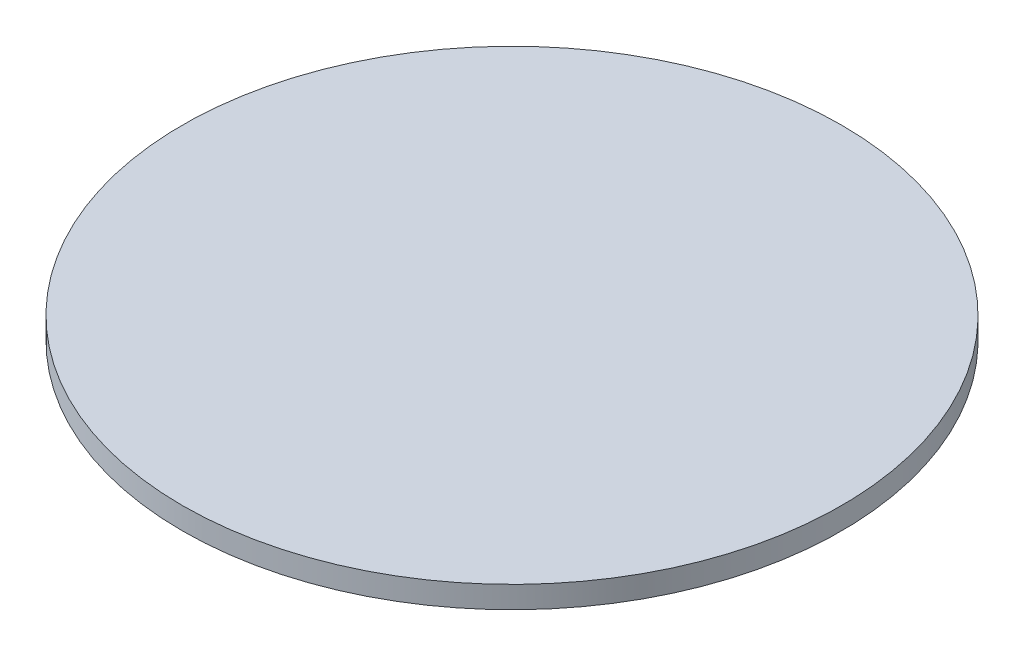
ISO-10303-21;
HEADER;
FILE_DESCRIPTION(('STEP AP214'),'2;1');
FILE_NAME('part.step','',(''),(''),'','','');
FILE_SCHEMA(('AUTOMOTIVE_DESIGN { 1 0 10303 214 1 1 1 1 }'));
ENDSEC;
DATA;
#1=APPLICATION_CONTEXT('core data for automotive mechanical design processes');
#2=APPLICATION_PROTOCOL_DEFINITION('international standard','automotive_design',2000,#1);
#3=PRODUCT_CONTEXT('',#1,'mechanical');
#4=PRODUCT('Part','Part','',(#3));
#5=PRODUCT_RELATED_PRODUCT_CATEGORY('part','',(#4));
#6=PRODUCT_DEFINITION_FORMATION('','',#4);
#7=PRODUCT_DEFINITION_CONTEXT('part definition',#1,'design');
#8=PRODUCT_DEFINITION('design','',#6,#7);
#9=PRODUCT_DEFINITION_SHAPE('','',#8);
#10=(LENGTH_UNIT() NAMED_UNIT(*) SI_UNIT(.MILLI.,.METRE.));
#11=(NAMED_UNIT(*) PLANE_ANGLE_UNIT() SI_UNIT($,.RADIAN.));
#12=(NAMED_UNIT(*) SI_UNIT($,.STERADIAN.) SOLID_ANGLE_UNIT());
#13=UNCERTAINTY_MEASURE_WITH_UNIT(LENGTH_MEASURE(1.E-05),#10,'distance_accuracy_value','');
#14=(GEOMETRIC_REPRESENTATION_CONTEXT(3) GLOBAL_UNCERTAINTY_ASSIGNED_CONTEXT((#13)) GLOBAL_UNIT_ASSIGNED_CONTEXT((#10,
#11,#12)) REPRESENTATION_CONTEXT('',''));
#15=CARTESIAN_POINT('',(0.,0.,0.));
#16=DIRECTION('',(0.,0.,1.));
#17=DIRECTION('',(1.,0.,0.));
#18=AXIS2_PLACEMENT_3D('',#15,#16,#17);
#19=CARTESIAN_POINT('',(0.,10.,0.));
#20=DIRECTION('',(0.,-1.,0.));
#21=DIRECTION('',(0.,0.,-1.));
#22=AXIS2_PLACEMENT_3D('',#19,#20,#21);
#23=CYLINDRICAL_SURFACE('',#22,150.);
#24=CARTESIAN_POINT('',(0.,10.,0.));
#25=DIRECTION('',(0.,1.,0.));
#26=DIRECTION('',(0.,0.,1.));
#27=AXIS2_PLACEMENT_3D('',#24,#25,#26);
#28=CIRCLE('',#27,150.);
#29=CARTESIAN_POINT('',(0.,10.,150.));
#30=VERTEX_POINT('',#29);
#31=EDGE_CURVE('E10',#30,#30,#28,.T.);
#32=ORIENTED_EDGE('',*,*,#31,.F.);
#33=EDGE_LOOP('',(#32));
#34=FACE_BOUND('',#33,.T.);
#35=CARTESIAN_POINT('',(0.,0.,0.));
#36=DIRECTION('',(0.,1.,0.));
#37=DIRECTION('',(0.,0.,1.));
#38=AXIS2_PLACEMENT_3D('',#35,#36,#37);
#39=CIRCLE('',#38,150.);
#40=CARTESIAN_POINT('',(0.,0.,150.));
#41=VERTEX_POINT('',#40);
#42=EDGE_CURVE('E40',#41,#41,#39,.T.);
#43=ORIENTED_EDGE('',*,*,#42,.T.);
#44=EDGE_LOOP('',(#43));
#45=FACE_BOUND('',#44,.T.);
#46=ADVANCED_FACE('F37',(#34,#45),#23,.T.);
#47=CARTESIAN_POINT('',(0.,10.,0.));
#48=DIRECTION('',(0.,1.,0.));
#49=DIRECTION('',(0.,0.,1.));
#50=AXIS2_PLACEMENT_3D('',#47,#48,#49);
#51=PLANE('',#50);
#52=ORIENTED_EDGE('',*,*,#31,.T.);
#53=EDGE_LOOP('',(#52));
#54=FACE_BOUND('',#53,.T.);
#55=ADVANCED_FACE('F54',(#54),#51,.T.);
#56=CARTESIAN_POINT('',(0.,0.,0.));
#57=DIRECTION('',(0.,1.,0.));
#58=DIRECTION('',(0.,0.,1.));
#59=AXIS2_PLACEMENT_3D('',#56,#57,#58);
#60=PLANE('',#59);
#61=ORIENTED_EDGE('',*,*,#42,.F.);
#62=EDGE_LOOP('',(#61));
#63=FACE_BOUND('',#62,.T.);
#64=ADVANCED_FACE('F52',(#63),#60,.F.);
#65=CLOSED_SHELL('',(#46,#55,#64));
#66=MANIFOLD_SOLID_BREP('B2',#65);
#67=ADVANCED_BREP_SHAPE_REPRESENTATION('',(#18,#66),#14);
#68=SHAPE_DEFINITION_REPRESENTATION(#9,#67);
ENDSEC;
END-ISO-10303-21;
